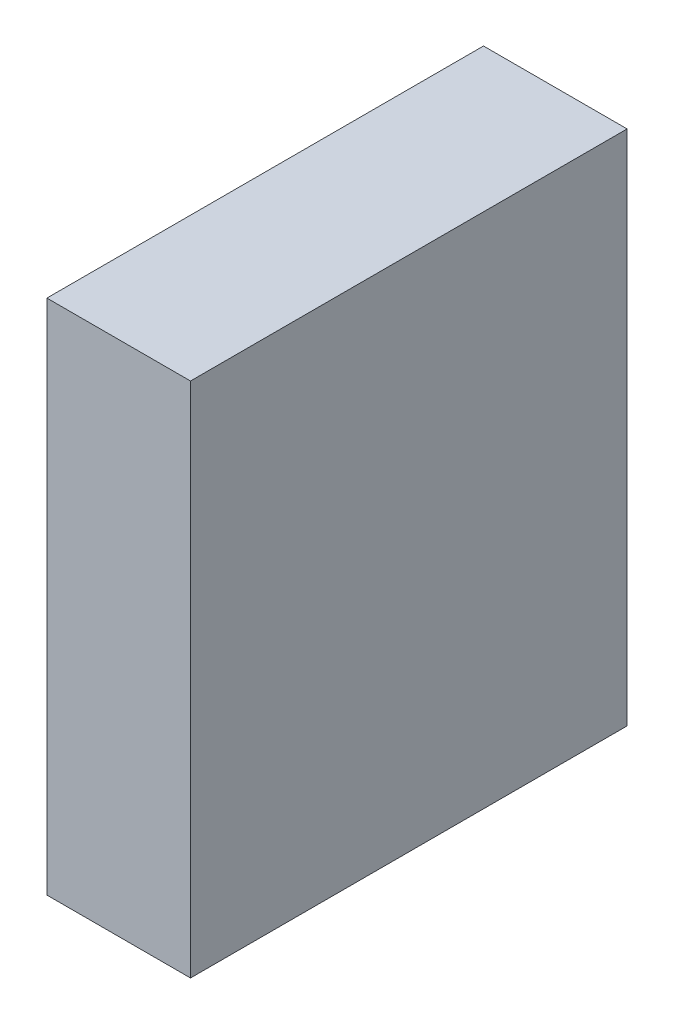
ISO-10303-21;
HEADER;
FILE_DESCRIPTION(('STEP AP214'),'2;1');
FILE_NAME('part.step','',(''),(''),'','','');
FILE_SCHEMA(('AUTOMOTIVE_DESIGN { 1 0 10303 214 1 1 1 1 }'));
ENDSEC;
DATA;
#1=APPLICATION_CONTEXT('core data for automotive mechanical design processes');
#2=APPLICATION_PROTOCOL_DEFINITION('international standard','automotive_design',2000,#1);
#3=PRODUCT_CONTEXT('',#1,'mechanical');
#4=PRODUCT('Part','Part','',(#3));
#5=PRODUCT_RELATED_PRODUCT_CATEGORY('part','',(#4));
#6=PRODUCT_DEFINITION_FORMATION('','',#4);
#7=PRODUCT_DEFINITION_CONTEXT('part definition',#1,'design');
#8=PRODUCT_DEFINITION('design','',#6,#7);
#9=PRODUCT_DEFINITION_SHAPE('','',#8);
#10=(LENGTH_UNIT() NAMED_UNIT(*) SI_UNIT(.MILLI.,.METRE.));
#11=(NAMED_UNIT(*) PLANE_ANGLE_UNIT() SI_UNIT($,.RADIAN.));
#12=(NAMED_UNIT(*) SI_UNIT($,.STERADIAN.) SOLID_ANGLE_UNIT());
#13=UNCERTAINTY_MEASURE_WITH_UNIT(LENGTH_MEASURE(1.E-05),#10,'distance_accuracy_value','');
#14=(GEOMETRIC_REPRESENTATION_CONTEXT(3) GLOBAL_UNCERTAINTY_ASSIGNED_CONTEXT((#13)) GLOBAL_UNIT_ASSIGNED_CONTEXT((#10,
#11,#12)) REPRESENTATION_CONTEXT('',''));
#15=CARTESIAN_POINT('',(0.,0.,0.));
#16=DIRECTION('',(0.,0.,1.));
#17=DIRECTION('',(1.,0.,0.));
#18=AXIS2_PLACEMENT_3D('',#15,#16,#17);
#19=CARTESIAN_POINT('',(38.12499934,20.124999728242,0.));
#20=DIRECTION('',(-1.,0.,0.));
#21=DIRECTION('',(0.,0.,1.));
#22=AXIS2_PLACEMENT_3D('',#19,#20,#21);
#23=PLANE('',#22);
#24=DIRECTION('',(0.,0.,-1.));
#25=VECTOR('',#24,1.);
#26=CARTESIAN_POINT('',(38.12499934,21.924998668242,0.));
#27=LINE('',#26,#25);
#28=CARTESIAN_POINT('',(38.12499934,21.924998668242,0.));
#29=VERTEX_POINT('',#28);
#30=CARTESIAN_POINT('',(38.12499934,21.924998668242,1.5199995));
#31=VERTEX_POINT('',#30);
#32=EDGE_CURVE('E20',#29,#31,#27,.F.);
#33=ORIENTED_EDGE('',*,*,#32,.T.);
#34=DIRECTION('',(0.,1.,0.));
#35=VECTOR('',#34,1.);
#36=CARTESIAN_POINT('',(38.12499934,21.024999198242,1.5199995));
#37=LINE('',#36,#35);
#38=CARTESIAN_POINT('',(38.12499934,20.124999728242,1.5199995));
#39=VERTEX_POINT('',#38);
#40=EDGE_CURVE('E55',#39,#31,#37,.T.);
#41=ORIENTED_EDGE('',*,*,#40,.F.);
#42=DIRECTION('',(0.,0.,1.));
#43=VECTOR('',#42,1.);
#44=CARTESIAN_POINT('',(38.12499934,20.124999728242,0.));
#45=LINE('',#44,#43);
#46=CARTESIAN_POINT('',(38.12499934,20.124999728242,0.));
#47=VERTEX_POINT('',#46);
#48=EDGE_CURVE('E74',#39,#47,#45,.F.);
#49=ORIENTED_EDGE('',*,*,#48,.T.);
#50=DIRECTION('',(0.,1.,0.));
#51=VECTOR('',#50,1.);
#52=CARTESIAN_POINT('',(38.12499934,21.024999198242,0.));
#53=LINE('',#52,#51);
#54=EDGE_CURVE('E66',#47,#29,#53,.T.);
#55=ORIENTED_EDGE('',*,*,#54,.T.);
#56=EDGE_LOOP('',(#33,#41,#49,#55));
#57=FACE_BOUND('',#56,.T.);
#58=ADVANCED_FACE('F17',(#57),#23,.F.);
#59=CARTESIAN_POINT('',(38.12499934,21.924998668242,0.));
#60=DIRECTION('',(0.,-1.,0.));
#61=DIRECTION('',(0.,0.,-1.));
#62=AXIS2_PLACEMENT_3D('',#59,#60,#61);
#63=PLANE('',#62);
#64=DIRECTION('',(0.,0.,-1.));
#65=VECTOR('',#64,1.);
#66=CARTESIAN_POINT('',(37.62500034,21.924998668242,0.));
#67=LINE('',#66,#65);
#68=CARTESIAN_POINT('',(37.62500034,21.924998668242,0.));
#69=VERTEX_POINT('',#68);
#70=CARTESIAN_POINT('',(37.62500034,21.924998668242,1.5199995));
#71=VERTEX_POINT('',#70);
#72=EDGE_CURVE('E72',#69,#71,#67,.F.);
#73=ORIENTED_EDGE('',*,*,#72,.T.);
#74=DIRECTION('',(1.,0.,0.));
#75=VECTOR('',#74,1.);
#76=CARTESIAN_POINT('',(37.87499984,21.924998668242,1.5199995));
#77=LINE('',#76,#75);
#78=EDGE_CURVE('E62',#31,#71,#77,.F.);
#79=ORIENTED_EDGE('',*,*,#78,.F.);
#80=ORIENTED_EDGE('',*,*,#32,.F.);
#81=DIRECTION('',(1.,0.,0.));
#82=VECTOR('',#81,1.);
#83=CARTESIAN_POINT('',(37.87499984,21.924998668242,0.));
#84=LINE('',#83,#82);
#85=EDGE_CURVE('E80',#29,#69,#84,.F.);
#86=ORIENTED_EDGE('',*,*,#85,.T.);
#87=EDGE_LOOP('',(#73,#79,#80,#86));
#88=FACE_BOUND('',#87,.T.);
#89=ADVANCED_FACE('F71',(#88),#63,.F.);
#90=CARTESIAN_POINT('',(37.87499984,21.024999198242,1.5199995));
#91=DIRECTION('',(0.,0.,1.));
#92=DIRECTION('',(1.,0.,0.));
#93=AXIS2_PLACEMENT_3D('',#90,#91,#92);
#94=PLANE('',#93);
#95=ORIENTED_EDGE('',*,*,#40,.T.);
#96=ORIENTED_EDGE('',*,*,#78,.T.);
#97=DIRECTION('',(0.,1.,0.));
#98=VECTOR('',#97,1.);
#99=CARTESIAN_POINT('',(37.62500034,21.924998668242,1.5199995));
#100=LINE('',#99,#98);
#101=CARTESIAN_POINT('',(37.62500034,20.124999728242,1.5199995));
#102=VERTEX_POINT('',#101);
#103=EDGE_CURVE('E83',#71,#102,#100,.F.);
#104=ORIENTED_EDGE('',*,*,#103,.T.);
#105=DIRECTION('',(1.,0.,0.));
#106=VECTOR('',#105,1.);
#107=CARTESIAN_POINT('',(37.62500034,20.124999728242,1.5199995));
#108=LINE('',#107,#106);
#109=EDGE_CURVE('E64',#102,#39,#108,.T.);
#110=ORIENTED_EDGE('',*,*,#109,.T.);
#111=EDGE_LOOP('',(#95,#96,#104,#110));
#112=FACE_BOUND('',#111,.T.);
#113=ADVANCED_FACE('F59',(#112),#94,.T.);
#114=CARTESIAN_POINT('',(37.62500034,20.124999728242,0.));
#115=DIRECTION('',(0.,1.,0.));
#116=DIRECTION('',(0.,0.,1.));
#117=AXIS2_PLACEMENT_3D('',#114,#115,#116);
#118=PLANE('',#117);
#119=ORIENTED_EDGE('',*,*,#48,.F.);
#120=ORIENTED_EDGE('',*,*,#109,.F.);
#121=DIRECTION('',(0.,0.,-1.));
#122=VECTOR('',#121,1.);
#123=CARTESIAN_POINT('',(37.62500034,20.124999728242,0.));
#124=LINE('',#123,#122);
#125=CARTESIAN_POINT('',(37.62500034,20.124999728242,0.));
#126=VERTEX_POINT('',#125);
#127=EDGE_CURVE('E26',#102,#126,#124,.T.);
#128=ORIENTED_EDGE('',*,*,#127,.T.);
#129=DIRECTION('',(1.,0.,0.));
#130=VECTOR('',#129,1.);
#131=CARTESIAN_POINT('',(37.87499984,20.124999728242,0.));
#132=LINE('',#131,#130);
#133=EDGE_CURVE('E34',#126,#47,#132,.T.);
#134=ORIENTED_EDGE('',*,*,#133,.T.);
#135=EDGE_LOOP('',(#119,#120,#128,#134));
#136=FACE_BOUND('',#135,.T.);
#137=ADVANCED_FACE('F88',(#136),#118,.F.);
#138=CARTESIAN_POINT('',(37.87499984,21.024999198242,0.));
#139=DIRECTION('',(0.,0.,1.));
#140=DIRECTION('',(1.,0.,0.));
#141=AXIS2_PLACEMENT_3D('',#138,#139,#140);
#142=PLANE('',#141);
#143=ORIENTED_EDGE('',*,*,#54,.F.);
#144=ORIENTED_EDGE('',*,*,#133,.F.);
#145=DIRECTION('',(0.,1.,0.));
#146=VECTOR('',#145,1.);
#147=CARTESIAN_POINT('',(37.62500034,21.924998668242,0.));
#148=LINE('',#147,#146);
#149=EDGE_CURVE('E11',#126,#69,#148,.T.);
#150=ORIENTED_EDGE('',*,*,#149,.T.);
#151=ORIENTED_EDGE('',*,*,#85,.F.);
#152=EDGE_LOOP('',(#143,#144,#150,#151));
#153=FACE_BOUND('',#152,.T.);
#154=ADVANCED_FACE('F91',(#153),#142,.F.);
#155=CARTESIAN_POINT('',(37.62500034,21.924998668242,0.));
#156=DIRECTION('',(1.,0.,0.));
#157=DIRECTION('',(0.,0.,-1.));
#158=AXIS2_PLACEMENT_3D('',#155,#156,#157);
#159=PLANE('',#158);
#160=ORIENTED_EDGE('',*,*,#127,.F.);
#161=ORIENTED_EDGE('',*,*,#103,.F.);
#162=ORIENTED_EDGE('',*,*,#72,.F.);
#163=ORIENTED_EDGE('',*,*,#149,.F.);
#164=EDGE_LOOP('',(#160,#161,#162,#163));
#165=FACE_BOUND('',#164,.T.);
#166=ADVANCED_FACE('F90',(#165),#159,.F.);
#167=CLOSED_SHELL('',(#58,#89,#113,#137,#154,#166));
#168=MANIFOLD_SOLID_BREP('B1',#167);
#169=ADVANCED_BREP_SHAPE_REPRESENTATION('',(#18,#168),#14);
#170=SHAPE_DEFINITION_REPRESENTATION(#9,#169);
ENDSEC;
END-ISO-10303-21;
